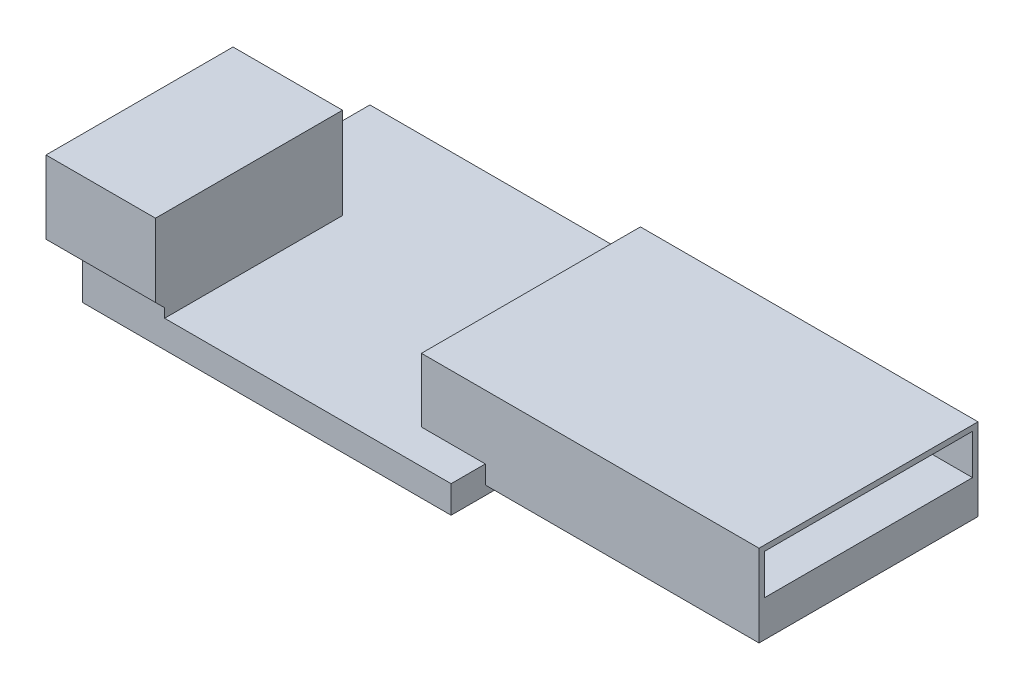
ISO-10303-21;
HEADER;
FILE_DESCRIPTION(('STEP AP214'),'2;1');
FILE_NAME('part.step','',(''),(''),'','','');
FILE_SCHEMA(('AUTOMOTIVE_DESIGN { 1 0 10303 214 1 1 1 1 }'));
ENDSEC;
DATA;
#1=APPLICATION_CONTEXT('core data for automotive mechanical design processes');
#2=APPLICATION_PROTOCOL_DEFINITION('international standard','automotive_design',2000,#1);
#3=PRODUCT_CONTEXT('',#1,'mechanical');
#4=PRODUCT('Part','Part','',(#3));
#5=PRODUCT_RELATED_PRODUCT_CATEGORY('part','',(#4));
#6=PRODUCT_DEFINITION_FORMATION('','',#4);
#7=PRODUCT_DEFINITION_CONTEXT('part definition',#1,'design');
#8=PRODUCT_DEFINITION('design','',#6,#7);
#9=PRODUCT_DEFINITION_SHAPE('','',#8);
#10=(LENGTH_UNIT() NAMED_UNIT(*) SI_UNIT(.MILLI.,.METRE.));
#11=(NAMED_UNIT(*) PLANE_ANGLE_UNIT() SI_UNIT($,.RADIAN.));
#12=(NAMED_UNIT(*) SI_UNIT($,.STERADIAN.) SOLID_ANGLE_UNIT());
#13=UNCERTAINTY_MEASURE_WITH_UNIT(LENGTH_MEASURE(1.E-05),#10,'distance_accuracy_value','');
#14=(GEOMETRIC_REPRESENTATION_CONTEXT(3) GLOBAL_UNCERTAINTY_ASSIGNED_CONTEXT((#13)) GLOBAL_UNIT_ASSIGNED_CONTEXT((#10,
#11,#12)) REPRESENTATION_CONTEXT('',''));
#15=CARTESIAN_POINT('',(0.,0.,0.));
#16=DIRECTION('',(0.,0.,1.));
#17=DIRECTION('',(1.,0.,0.));
#18=AXIS2_PLACEMENT_3D('',#15,#16,#17);
#19=CARTESIAN_POINT('',(0.,1.5,-15.75));
#20=DIRECTION('',(0.,1.,0.));
#21=DIRECTION('',(0.,0.,1.));
#22=AXIS2_PLACEMENT_3D('',#19,#20,#21);
#23=PLANE('',#22);
#24=DIRECTION('',(-1.,0.,0.));
#25=VECTOR('',#24,1.);
#26=CARTESIAN_POINT('',(-15.7,1.5,-9.75));
#27=LINE('',#26,#25);
#28=CARTESIAN_POINT('',(-15.7,1.5,-9.75));
#29=VERTEX_POINT('',#28);
#30=CARTESIAN_POINT('',(-20.2,1.5,-9.75));
#31=VERTEX_POINT('',#30);
#32=EDGE_CURVE('E335',#29,#31,#27,.T.);
#33=ORIENTED_EDGE('',*,*,#32,.F.);
#34=DIRECTION('',(0.,0.,1.));
#35=VECTOR('',#34,1.);
#36=CARTESIAN_POINT('',(-15.7,1.5,-15.75));
#37=LINE('',#36,#35);
#38=CARTESIAN_POINT('',(-15.7,1.5,0.));
#39=VERTEX_POINT('',#38);
#40=EDGE_CURVE('E198',#29,#39,#37,.T.);
#41=ORIENTED_EDGE('',*,*,#40,.T.);
#42=DIRECTION('',(1.,0.,0.));
#43=VECTOR('',#42,1.);
#44=CARTESIAN_POINT('',(0.,1.5,0.));
#45=LINE('',#44,#43);
#46=CARTESIAN_POINT('',(0.,1.5,0.));
#47=VERTEX_POINT('',#46);
#48=EDGE_CURVE('E280',#39,#47,#45,.T.);
#49=ORIENTED_EDGE('',*,*,#48,.T.);
#50=DIRECTION('',(0.,0.,-1.));
#51=VECTOR('',#50,1.);
#52=CARTESIAN_POINT('',(0.,1.5,0.));
#53=LINE('',#52,#51);
#54=CARTESIAN_POINT('',(0.,1.5,-1.875));
#55=VERTEX_POINT('',#54);
#56=EDGE_CURVE('E271',#47,#55,#53,.T.);
#57=ORIENTED_EDGE('',*,*,#56,.T.);
#58=DIRECTION('',(1.,0.,0.));
#59=VECTOR('',#58,1.);
#60=CARTESIAN_POINT('',(0.,1.5,-1.875));
#61=LINE('',#60,#59);
#62=CARTESIAN_POINT('',(-3.5,1.5,-1.875));
#63=VERTEX_POINT('',#62);
#64=EDGE_CURVE('E300',#63,#55,#61,.T.);
#65=ORIENTED_EDGE('',*,*,#64,.F.);
#66=DIRECTION('',(0.,0.,1.));
#67=VECTOR('',#66,1.);
#68=CARTESIAN_POINT('',(-3.5,1.5,-15.75));
#69=LINE('',#68,#67);
#70=CARTESIAN_POINT('',(-3.5,1.5,-13.875));
#71=VERTEX_POINT('',#70);
#72=EDGE_CURVE('E303',#71,#63,#69,.T.);
#73=ORIENTED_EDGE('',*,*,#72,.F.);
#74=DIRECTION('',(-1.,0.,0.));
#75=VECTOR('',#74,1.);
#76=CARTESIAN_POINT('',(0.,1.5,-13.875));
#77=LINE('',#76,#75);
#78=CARTESIAN_POINT('',(0.,1.5,-13.875));
#79=VERTEX_POINT('',#78);
#80=EDGE_CURVE('E306',#79,#71,#77,.T.);
#81=ORIENTED_EDGE('',*,*,#80,.F.);
#82=CARTESIAN_POINT('',(0.,1.5,-15.75));
#83=VERTEX_POINT('',#82);
#84=EDGE_CURVE('E274',#79,#83,#53,.T.);
#85=ORIENTED_EDGE('',*,*,#84,.T.);
#86=DIRECTION('',(-1.,0.,0.));
#87=VECTOR('',#86,1.);
#88=CARTESIAN_POINT('',(0.,1.5,-15.75));
#89=LINE('',#88,#87);
#90=CARTESIAN_POINT('',(-20.2,1.5,-15.75));
#91=VERTEX_POINT('',#90);
#92=EDGE_CURVE('E273',#83,#91,#89,.T.);
#93=ORIENTED_EDGE('',*,*,#92,.T.);
#94=DIRECTION('',(0.,0.,1.));
#95=VECTOR('',#94,1.);
#96=CARTESIAN_POINT('',(-20.2,1.5,0.));
#97=LINE('',#96,#95);
#98=EDGE_CURVE('E277',#91,#31,#97,.T.);
#99=ORIENTED_EDGE('',*,*,#98,.T.);
#100=EDGE_LOOP('',(#33,#41,#49,#57,#65,#73,#81,#85,#93,#99));
#101=FACE_BOUND('',#100,.T.);
#102=ADVANCED_FACE('F32',(#101),#23,.T.);
#103=CARTESIAN_POINT('',(0.,1.5,0.));
#104=DIRECTION('',(-1.,0.,0.));
#105=DIRECTION('',(0.,0.,1.));
#106=AXIS2_PLACEMENT_3D('',#103,#104,#105);
#107=PLANE('',#106);
#108=ORIENTED_EDGE('',*,*,#84,.F.);
#109=DIRECTION('',(0.,-1.,0.));
#110=VECTOR('',#109,1.);
#111=CARTESIAN_POINT('',(0.,1.5,-13.875));
#112=LINE('',#111,#110);
#113=CARTESIAN_POINT('',(0.,0.5,-13.875));
#114=VERTEX_POINT('',#113);
#115=EDGE_CURVE('E268',#79,#114,#112,.T.);
#116=ORIENTED_EDGE('',*,*,#115,.T.);
#117=DIRECTION('',(0.,0.,-1.));
#118=VECTOR('',#117,1.);
#119=CARTESIAN_POINT('',(0.,0.5,0.));
#120=LINE('',#119,#118);
#121=CARTESIAN_POINT('',(0.,0.5,-1.875));
#122=VERTEX_POINT('',#121);
#123=EDGE_CURVE('E309',#122,#114,#120,.T.);
#124=ORIENTED_EDGE('',*,*,#123,.F.);
#125=DIRECTION('',(0.,1.,0.));
#126=VECTOR('',#125,1.);
#127=CARTESIAN_POINT('',(0.,1.5,-1.875));
#128=LINE('',#127,#126);
#129=EDGE_CURVE('E260',#122,#55,#128,.T.);
#130=ORIENTED_EDGE('',*,*,#129,.T.);
#131=ORIENTED_EDGE('',*,*,#56,.F.);
#132=DIRECTION('',(0.,-1.,0.));
#133=VECTOR('',#132,1.);
#134=CARTESIAN_POINT('',(0.,1.5,0.));
#135=LINE('',#134,#133);
#136=CARTESIAN_POINT('',(0.,0.,0.));
#137=VERTEX_POINT('',#136);
#138=EDGE_CURVE('E282',#47,#137,#135,.T.);
#139=ORIENTED_EDGE('',*,*,#138,.T.);
#140=DIRECTION('',(0.,0.,-1.));
#141=VECTOR('',#140,1.);
#142=CARTESIAN_POINT('',(0.,0.,0.));
#143=LINE('',#142,#141);
#144=CARTESIAN_POINT('',(0.,0.,-15.75));
#145=VERTEX_POINT('',#144);
#146=EDGE_CURVE('E270',#137,#145,#143,.T.);
#147=ORIENTED_EDGE('',*,*,#146,.T.);
#148=DIRECTION('',(0.,-1.,0.));
#149=VECTOR('',#148,1.);
#150=CARTESIAN_POINT('',(0.,1.5,-15.75));
#151=LINE('',#150,#149);
#152=EDGE_CURVE('E297',#83,#145,#151,.T.);
#153=ORIENTED_EDGE('',*,*,#152,.F.);
#154=EDGE_LOOP('',(#108,#116,#124,#130,#131,#139,#147,#153));
#155=FACE_BOUND('',#154,.T.);
#156=ADVANCED_FACE('F354',(#155),#107,.F.);
#157=CARTESIAN_POINT('',(0.,1.5,-15.75));
#158=DIRECTION('',(0.,0.,1.));
#159=DIRECTION('',(1.,0.,0.));
#160=AXIS2_PLACEMENT_3D('',#157,#158,#159);
#161=PLANE('',#160);
#162=DIRECTION('',(-1.,0.,0.));
#163=VECTOR('',#162,1.);
#164=CARTESIAN_POINT('',(0.,0.,-15.75));
#165=LINE('',#164,#163);
#166=CARTESIAN_POINT('',(-20.2,0.,-15.75));
#167=VERTEX_POINT('',#166);
#168=EDGE_CURVE('E285',#145,#167,#165,.T.);
#169=ORIENTED_EDGE('',*,*,#168,.T.);
#170=DIRECTION('',(0.,-1.,0.));
#171=VECTOR('',#170,1.);
#172=CARTESIAN_POINT('',(-20.2,1.5,-15.75));
#173=LINE('',#172,#171);
#174=EDGE_CURVE('E294',#91,#167,#173,.T.);
#175=ORIENTED_EDGE('',*,*,#174,.F.);
#176=ORIENTED_EDGE('',*,*,#92,.F.);
#177=ORIENTED_EDGE('',*,*,#152,.T.);
#178=EDGE_LOOP('',(#169,#175,#176,#177));
#179=FACE_BOUND('',#178,.T.);
#180=ADVANCED_FACE('F375',(#179),#161,.F.);
#181=CARTESIAN_POINT('',(-20.2,1.5,0.));
#182=DIRECTION('',(1.,0.,0.));
#183=DIRECTION('',(0.,0.,-1.));
#184=AXIS2_PLACEMENT_3D('',#181,#182,#183);
#185=PLANE('',#184);
#186=DIRECTION('',(0.,0.,1.));
#187=VECTOR('',#186,1.);
#188=CARTESIAN_POINT('',(-20.2,0.,0.));
#189=LINE('',#188,#187);
#190=CARTESIAN_POINT('',(-20.2,0.,0.));
#191=VERTEX_POINT('',#190);
#192=EDGE_CURVE('E287',#167,#191,#189,.T.);
#193=ORIENTED_EDGE('',*,*,#192,.T.);
#194=DIRECTION('',(0.,-1.,0.));
#195=VECTOR('',#194,1.);
#196=CARTESIAN_POINT('',(-20.2,1.5,0.));
#197=LINE('',#196,#195);
#198=CARTESIAN_POINT('',(-20.2,2.00000000000001,0.));
#199=VERTEX_POINT('',#198);
#200=EDGE_CURVE('E46',#199,#191,#197,.T.);
#201=ORIENTED_EDGE('',*,*,#200,.F.);
#202=DIRECTION('',(0.,0.707106781186551,0.707106781186544));
#203=VECTOR('',#202,1.);
#204=CARTESIAN_POINT('',(-20.2,1.75,-0.250000000000003));
#205=LINE('',#204,#203);
#206=CARTESIAN_POINT('',(-20.2,1.5,-0.500000000000004));
#207=VERTEX_POINT('',#206);
#208=EDGE_CURVE('E11',#199,#207,#205,.F.);
#209=ORIENTED_EDGE('',*,*,#208,.T.);
#210=EDGE_CURVE('E276',#31,#207,#97,.T.);
#211=ORIENTED_EDGE('',*,*,#210,.F.);
#212=ORIENTED_EDGE('',*,*,#98,.F.);
#213=ORIENTED_EDGE('',*,*,#174,.T.);
#214=EDGE_LOOP('',(#193,#201,#209,#211,#212,#213));
#215=FACE_BOUND('',#214,.T.);
#216=ADVANCED_FACE('F331',(#215),#185,.F.);
#217=CARTESIAN_POINT('',(0.,1.5,0.));
#218=DIRECTION('',(0.,0.,-1.));
#219=DIRECTION('',(-1.,0.,0.));
#220=AXIS2_PLACEMENT_3D('',#217,#218,#219);
#221=PLANE('',#220);
#222=DIRECTION('',(1.,0.,0.));
#223=VECTOR('',#222,1.);
#224=CARTESIAN_POINT('',(0.,0.,0.));
#225=LINE('',#224,#223);
#226=EDGE_CURVE('E289',#191,#137,#225,.T.);
#227=ORIENTED_EDGE('',*,*,#226,.T.);
#228=ORIENTED_EDGE('',*,*,#138,.F.);
#229=ORIENTED_EDGE('',*,*,#48,.F.);
#230=DIRECTION('',(0.,-1.,0.));
#231=VECTOR('',#230,1.);
#232=CARTESIAN_POINT('',(-15.7,6.5,0.));
#233=LINE('',#232,#231);
#234=CARTESIAN_POINT('',(-15.7,2.00000000000001,0.));
#235=VERTEX_POINT('',#234);
#236=EDGE_CURVE('E318',#235,#39,#233,.T.);
#237=ORIENTED_EDGE('',*,*,#236,.F.);
#238=DIRECTION('',(1.,0.,0.));
#239=VECTOR('',#238,1.);
#240=CARTESIAN_POINT('',(0.,2.00000000000001,0.));
#241=LINE('',#240,#239);
#242=EDGE_CURVE('E40',#235,#199,#241,.F.);
#243=ORIENTED_EDGE('',*,*,#242,.T.);
#244=ORIENTED_EDGE('',*,*,#200,.T.);
#245=EDGE_LOOP('',(#227,#228,#229,#237,#243,#244));
#246=FACE_BOUND('',#245,.T.);
#247=ADVANCED_FACE('F325',(#246),#221,.F.);
#248=CARTESIAN_POINT('',(0.,0.,-15.75));
#249=DIRECTION('',(0.,1.,0.));
#250=DIRECTION('',(0.,0.,1.));
#251=AXIS2_PLACEMENT_3D('',#248,#249,#250);
#252=PLANE('',#251);
#253=ORIENTED_EDGE('',*,*,#146,.F.);
#254=ORIENTED_EDGE('',*,*,#226,.F.);
#255=ORIENTED_EDGE('',*,*,#192,.F.);
#256=ORIENTED_EDGE('',*,*,#168,.F.);
#257=EDGE_LOOP('',(#253,#254,#255,#256));
#258=FACE_BOUND('',#257,.T.);
#259=ADVANCED_FACE('F379',(#258),#252,.F.);
#260=CARTESIAN_POINT('',(-3.5,0.5,-1.875));
#261=DIRECTION('',(0.,1.,0.));
#262=DIRECTION('',(0.,0.,1.));
#263=AXIS2_PLACEMENT_3D('',#260,#261,#262);
#264=PLANE('',#263);
#265=DIRECTION('',(1.,0.,0.));
#266=VECTOR('',#265,1.);
#267=CARTESIAN_POINT('',(-3.5,0.5,-1.875));
#268=LINE('',#267,#266);
#269=CARTESIAN_POINT('',(15.,0.5,-1.875));
#270=VERTEX_POINT('',#269);
#271=EDGE_CURVE('E249',#122,#270,#268,.T.);
#272=ORIENTED_EDGE('',*,*,#271,.F.);
#273=ORIENTED_EDGE('',*,*,#123,.T.);
#274=DIRECTION('',(-1.,0.,0.));
#275=VECTOR('',#274,1.);
#276=CARTESIAN_POINT('',(-3.5,0.5,-13.875));
#277=LINE('',#276,#275);
#278=CARTESIAN_POINT('',(15.,0.5,-13.875));
#279=VERTEX_POINT('',#278);
#280=EDGE_CURVE('E254',#279,#114,#277,.T.);
#281=ORIENTED_EDGE('',*,*,#280,.F.);
#282=DIRECTION('',(0.,0.,-1.));
#283=VECTOR('',#282,1.);
#284=CARTESIAN_POINT('',(15.,0.5,-13.875));
#285=LINE('',#284,#283);
#286=EDGE_CURVE('E251',#270,#279,#285,.T.);
#287=ORIENTED_EDGE('',*,*,#286,.F.);
#288=EDGE_LOOP('',(#272,#273,#281,#287));
#289=FACE_BOUND('',#288,.T.);
#290=ADVANCED_FACE('F381',(#289),#264,.F.);
#291=CARTESIAN_POINT('',(-3.5,0.5,-13.875));
#292=DIRECTION('',(0.,0.,-1.));
#293=DIRECTION('',(-1.,0.,0.));
#294=AXIS2_PLACEMENT_3D('',#291,#292,#293);
#295=PLANE('',#294);
#296=ORIENTED_EDGE('',*,*,#115,.F.);
#297=ORIENTED_EDGE('',*,*,#80,.T.);
#298=DIRECTION('',(0.,1.,0.));
#299=VECTOR('',#298,1.);
#300=CARTESIAN_POINT('',(-3.5,0.5,-13.875));
#301=LINE('',#300,#299);
#302=CARTESIAN_POINT('',(-3.5,5.,-13.875));
#303=VERTEX_POINT('',#302);
#304=EDGE_CURVE('E258',#71,#303,#301,.T.);
#305=ORIENTED_EDGE('',*,*,#304,.T.);
#306=DIRECTION('',(-1.,0.,0.));
#307=VECTOR('',#306,1.);
#308=CARTESIAN_POINT('',(-3.5,5.,-13.875));
#309=LINE('',#308,#307);
#310=CARTESIAN_POINT('',(15.,5.,-13.875));
#311=VERTEX_POINT('',#310);
#312=EDGE_CURVE('E246',#311,#303,#309,.T.);
#313=ORIENTED_EDGE('',*,*,#312,.F.);
#314=DIRECTION('',(0.,1.,0.));
#315=VECTOR('',#314,1.);
#316=CARTESIAN_POINT('',(15.,0.5,-13.875));
#317=LINE('',#316,#315);
#318=EDGE_CURVE('E261',#279,#311,#317,.T.);
#319=ORIENTED_EDGE('',*,*,#318,.F.);
#320=ORIENTED_EDGE('',*,*,#280,.T.);
#321=EDGE_LOOP('',(#296,#297,#305,#313,#319,#320));
#322=FACE_BOUND('',#321,.T.);
#323=ADVANCED_FACE('F371',(#322),#295,.T.);
#324=CARTESIAN_POINT('',(-3.5,0.5,-1.875));
#325=DIRECTION('',(0.,0.,1.));
#326=DIRECTION('',(1.,0.,0.));
#327=AXIS2_PLACEMENT_3D('',#324,#325,#326);
#328=PLANE('',#327);
#329=ORIENTED_EDGE('',*,*,#129,.F.);
#330=ORIENTED_EDGE('',*,*,#271,.T.);
#331=DIRECTION('',(0.,1.,0.));
#332=VECTOR('',#331,1.);
#333=CARTESIAN_POINT('',(15.,0.5,-1.875));
#334=LINE('',#333,#332);
#335=CARTESIAN_POINT('',(15.,5.,-1.875));
#336=VERTEX_POINT('',#335);
#337=EDGE_CURVE('E263',#270,#336,#334,.T.);
#338=ORIENTED_EDGE('',*,*,#337,.T.);
#339=DIRECTION('',(1.,0.,0.));
#340=VECTOR('',#339,1.);
#341=CARTESIAN_POINT('',(-3.5,5.,-1.875));
#342=LINE('',#341,#340);
#343=CARTESIAN_POINT('',(-3.5,5.,-1.875));
#344=VERTEX_POINT('',#343);
#345=EDGE_CURVE('E240',#344,#336,#342,.T.);
#346=ORIENTED_EDGE('',*,*,#345,.F.);
#347=DIRECTION('',(0.,1.,0.));
#348=VECTOR('',#347,1.);
#349=CARTESIAN_POINT('',(-3.5,0.5,-1.875));
#350=LINE('',#349,#348);
#351=EDGE_CURVE('E257',#63,#344,#350,.T.);
#352=ORIENTED_EDGE('',*,*,#351,.F.);
#353=ORIENTED_EDGE('',*,*,#64,.T.);
#354=EDGE_LOOP('',(#329,#330,#338,#346,#352,#353));
#355=FACE_BOUND('',#354,.T.);
#356=ADVANCED_FACE('F363',(#355),#328,.T.);
#357=CARTESIAN_POINT('',(-3.5,0.5,-13.875));
#358=DIRECTION('',(-1.,0.,0.));
#359=DIRECTION('',(0.,0.,1.));
#360=AXIS2_PLACEMENT_3D('',#357,#358,#359);
#361=PLANE('',#360);
#362=ORIENTED_EDGE('',*,*,#304,.F.);
#363=ORIENTED_EDGE('',*,*,#72,.T.);
#364=ORIENTED_EDGE('',*,*,#351,.T.);
#365=DIRECTION('',(0.,0.,1.));
#366=VECTOR('',#365,1.);
#367=CARTESIAN_POINT('',(-3.5,5.,-13.875));
#368=LINE('',#367,#366);
#369=EDGE_CURVE('E231',#303,#344,#368,.T.);
#370=ORIENTED_EDGE('',*,*,#369,.F.);
#371=EDGE_LOOP('',(#362,#363,#364,#370));
#372=FACE_BOUND('',#371,.T.);
#373=ADVANCED_FACE('F360',(#372),#361,.T.);
#374=CARTESIAN_POINT('',(15.,0.5,-13.875));
#375=DIRECTION('',(1.,0.,0.));
#376=DIRECTION('',(0.,0.,-1.));
#377=AXIS2_PLACEMENT_3D('',#374,#375,#376);
#378=PLANE('',#377);
#379=DIRECTION('',(0.,-1.,0.));
#380=VECTOR('',#379,1.);
#381=CARTESIAN_POINT('',(15.,4.7,-2.175));
#382=LINE('',#381,#380);
#383=CARTESIAN_POINT('',(15.,4.7,-2.175));
#384=VERTEX_POINT('',#383);
#385=CARTESIAN_POINT('',(15.,2.5,-2.175));
#386=VERTEX_POINT('',#385);
#387=EDGE_CURVE('E200',#384,#386,#382,.T.);
#388=ORIENTED_EDGE('',*,*,#387,.F.);
#389=DIRECTION('',(0.,0.,1.));
#390=VECTOR('',#389,1.);
#391=CARTESIAN_POINT('',(15.,4.7,-2.175));
#392=LINE('',#391,#390);
#393=CARTESIAN_POINT('',(15.,4.7,-13.575));
#394=VERTEX_POINT('',#393);
#395=EDGE_CURVE('E212',#394,#384,#392,.T.);
#396=ORIENTED_EDGE('',*,*,#395,.F.);
#397=DIRECTION('',(0.,1.,0.));
#398=VECTOR('',#397,1.);
#399=CARTESIAN_POINT('',(15.,4.7,-13.575));
#400=LINE('',#399,#398);
#401=CARTESIAN_POINT('',(15.,2.5,-13.575));
#402=VERTEX_POINT('',#401);
#403=EDGE_CURVE('E224',#402,#394,#400,.T.);
#404=ORIENTED_EDGE('',*,*,#403,.F.);
#405=DIRECTION('',(0.,0.,-1.));
#406=VECTOR('',#405,1.);
#407=CARTESIAN_POINT('',(15.,2.5,-2.175));
#408=LINE('',#407,#406);
#409=EDGE_CURVE('E202',#386,#402,#408,.T.);
#410=ORIENTED_EDGE('',*,*,#409,.F.);
#411=EDGE_LOOP('',(#388,#396,#404,#410));
#412=FACE_BOUND('',#411,.T.);
#413=ORIENTED_EDGE('',*,*,#318,.T.);
#414=DIRECTION('',(0.,0.,-1.));
#415=VECTOR('',#414,1.);
#416=CARTESIAN_POINT('',(15.,5.,-13.875));
#417=LINE('',#416,#415);
#418=EDGE_CURVE('E243',#336,#311,#417,.T.);
#419=ORIENTED_EDGE('',*,*,#418,.F.);
#420=ORIENTED_EDGE('',*,*,#337,.F.);
#421=ORIENTED_EDGE('',*,*,#286,.T.);
#422=EDGE_LOOP('',(#413,#419,#420,#421));
#423=FACE_BOUND('',#422,.T.);
#424=ADVANCED_FACE('F398',(#412,#423),#378,.T.);
#425=CARTESIAN_POINT('',(-3.5,5.,-1.875));
#426=DIRECTION('',(0.,1.,0.));
#427=DIRECTION('',(0.,0.,1.));
#428=AXIS2_PLACEMENT_3D('',#425,#426,#427);
#429=PLANE('',#428);
#430=ORIENTED_EDGE('',*,*,#369,.T.);
#431=ORIENTED_EDGE('',*,*,#345,.T.);
#432=ORIENTED_EDGE('',*,*,#418,.T.);
#433=ORIENTED_EDGE('',*,*,#312,.T.);
#434=EDGE_LOOP('',(#430,#431,#432,#433));
#435=FACE_BOUND('',#434,.T.);
#436=ADVANCED_FACE('F367',(#435),#429,.T.);
#437=CARTESIAN_POINT('',(1.5,4.7,-2.175));
#438=DIRECTION('',(0.,0.,1.));
#439=DIRECTION('',(0.,-1.,0.));
#440=AXIS2_PLACEMENT_3D('',#437,#438,#439);
#441=PLANE('',#440);
#442=ORIENTED_EDGE('',*,*,#387,.T.);
#443=DIRECTION('',(1.,0.,0.));
#444=VECTOR('',#443,1.);
#445=CARTESIAN_POINT('',(1.5,2.5,-2.175));
#446=LINE('',#445,#444);
#447=CARTESIAN_POINT('',(1.5,2.5,-2.175));
#448=VERTEX_POINT('',#447);
#449=EDGE_CURVE('E220',#448,#386,#446,.T.);
#450=ORIENTED_EDGE('',*,*,#449,.F.);
#451=DIRECTION('',(0.,-1.,0.));
#452=VECTOR('',#451,1.);
#453=CARTESIAN_POINT('',(1.5,4.7,-2.175));
#454=LINE('',#453,#452);
#455=CARTESIAN_POINT('',(1.5,4.7,-2.175));
#456=VERTEX_POINT('',#455);
#457=EDGE_CURVE('E208',#456,#448,#454,.T.);
#458=ORIENTED_EDGE('',*,*,#457,.F.);
#459=DIRECTION('',(1.,0.,0.));
#460=VECTOR('',#459,1.);
#461=CARTESIAN_POINT('',(1.5,4.7,-2.175));
#462=LINE('',#461,#460);
#463=EDGE_CURVE('E229',#456,#384,#462,.T.);
#464=ORIENTED_EDGE('',*,*,#463,.T.);
#465=EDGE_LOOP('',(#442,#450,#458,#464));
#466=FACE_BOUND('',#465,.T.);
#467=ADVANCED_FACE('F408',(#466),#441,.F.);
#468=CARTESIAN_POINT('',(1.5,4.7,-2.175));
#469=DIRECTION('',(0.,1.,0.));
#470=DIRECTION('',(0.,0.,1.));
#471=AXIS2_PLACEMENT_3D('',#468,#469,#470);
#472=PLANE('',#471);
#473=ORIENTED_EDGE('',*,*,#395,.T.);
#474=ORIENTED_EDGE('',*,*,#463,.F.);
#475=DIRECTION('',(0.,0.,1.));
#476=VECTOR('',#475,1.);
#477=CARTESIAN_POINT('',(1.5,4.7,-2.175));
#478=LINE('',#477,#476);
#479=CARTESIAN_POINT('',(1.5,4.7,-13.575));
#480=VERTEX_POINT('',#479);
#481=EDGE_CURVE('E218',#480,#456,#478,.T.);
#482=ORIENTED_EDGE('',*,*,#481,.F.);
#483=DIRECTION('',(1.,0.,0.));
#484=VECTOR('',#483,1.);
#485=CARTESIAN_POINT('',(1.5,4.7,-13.575));
#486=LINE('',#485,#484);
#487=EDGE_CURVE('E232',#480,#394,#486,.T.);
#488=ORIENTED_EDGE('',*,*,#487,.T.);
#489=EDGE_LOOP('',(#473,#474,#482,#488));
#490=FACE_BOUND('',#489,.T.);
#491=ADVANCED_FACE('F411',(#490),#472,.F.);
#492=CARTESIAN_POINT('',(1.5,4.7,-13.575));
#493=DIRECTION('',(0.,0.,-1.));
#494=DIRECTION('',(-1.,0.,0.));
#495=AXIS2_PLACEMENT_3D('',#492,#493,#494);
#496=PLANE('',#495);
#497=ORIENTED_EDGE('',*,*,#403,.T.);
#498=ORIENTED_EDGE('',*,*,#487,.F.);
#499=DIRECTION('',(0.,1.,0.));
#500=VECTOR('',#499,1.);
#501=CARTESIAN_POINT('',(1.5,4.7,-13.575));
#502=LINE('',#501,#500);
#503=CARTESIAN_POINT('',(1.5,2.5,-13.575));
#504=VERTEX_POINT('',#503);
#505=EDGE_CURVE('E215',#504,#480,#502,.T.);
#506=ORIENTED_EDGE('',*,*,#505,.F.);
#507=DIRECTION('',(1.,0.,0.));
#508=VECTOR('',#507,1.);
#509=CARTESIAN_POINT('',(1.5,2.5,-13.575));
#510=LINE('',#509,#508);
#511=EDGE_CURVE('E234',#504,#402,#510,.T.);
#512=ORIENTED_EDGE('',*,*,#511,.T.);
#513=EDGE_LOOP('',(#497,#498,#506,#512));
#514=FACE_BOUND('',#513,.T.);
#515=ADVANCED_FACE('F417',(#514),#496,.F.);
#516=CARTESIAN_POINT('',(1.5,2.5,-2.175));
#517=DIRECTION('',(0.,-1.,0.));
#518=DIRECTION('',(0.,0.,-1.));
#519=AXIS2_PLACEMENT_3D('',#516,#517,#518);
#520=PLANE('',#519);
#521=ORIENTED_EDGE('',*,*,#409,.T.);
#522=ORIENTED_EDGE('',*,*,#511,.F.);
#523=DIRECTION('',(0.,0.,-1.));
#524=VECTOR('',#523,1.);
#525=CARTESIAN_POINT('',(1.5,2.5,-2.175));
#526=LINE('',#525,#524);
#527=EDGE_CURVE('E211',#448,#504,#526,.T.);
#528=ORIENTED_EDGE('',*,*,#527,.F.);
#529=ORIENTED_EDGE('',*,*,#449,.T.);
#530=EDGE_LOOP('',(#521,#522,#528,#529));
#531=FACE_BOUND('',#530,.T.);
#532=ADVANCED_FACE('F413',(#531),#520,.F.);
#533=CARTESIAN_POINT('',(1.5,2.5,-2.175));
#534=DIRECTION('',(1.,0.,0.));
#535=DIRECTION('',(0.,0.,-1.));
#536=AXIS2_PLACEMENT_3D('',#533,#534,#535);
#537=PLANE('',#536);
#538=ORIENTED_EDGE('',*,*,#457,.T.);
#539=ORIENTED_EDGE('',*,*,#527,.T.);
#540=ORIENTED_EDGE('',*,*,#505,.T.);
#541=ORIENTED_EDGE('',*,*,#481,.T.);
#542=EDGE_LOOP('',(#538,#539,#540,#541));
#543=FACE_BOUND('',#542,.T.);
#544=ADVANCED_FACE('F416',(#543),#537,.T.);
#545=CARTESIAN_POINT('',(-15.7,1.5,-9.75));
#546=DIRECTION('',(0.,1.,0.));
#547=DIRECTION('',(0.,0.,1.));
#548=AXIS2_PLACEMENT_3D('',#545,#546,#547);
#549=PLANE('',#548);
#550=ORIENTED_EDGE('',*,*,#210,.T.);
#551=DIRECTION('',(-1.,0.,0.));
#552=VECTOR('',#551,1.);
#553=CARTESIAN_POINT('',(-15.7,1.5,-0.500000000000004));
#554=LINE('',#553,#552);
#555=CARTESIAN_POINT('',(-21.7,1.5,-0.500000000000003));
#556=VERTEX_POINT('',#555);
#557=EDGE_CURVE('E54',#207,#556,#554,.T.);
#558=ORIENTED_EDGE('',*,*,#557,.T.);
#559=DIRECTION('',(0.,0.,1.));
#560=VECTOR('',#559,1.);
#561=CARTESIAN_POINT('',(-21.7,1.5,0.500000000000003));
#562=LINE('',#561,#560);
#563=CARTESIAN_POINT('',(-21.7,1.5,-9.75));
#564=VERTEX_POINT('',#563);
#565=EDGE_CURVE('E193',#564,#556,#562,.T.);
#566=ORIENTED_EDGE('',*,*,#565,.F.);
#567=EDGE_CURVE('E334',#31,#564,#27,.T.);
#568=ORIENTED_EDGE('',*,*,#567,.F.);
#569=EDGE_LOOP('',(#550,#558,#566,#568));
#570=FACE_BOUND('',#569,.T.);
#571=ADVANCED_FACE('F333',(#570),#549,.F.);
#572=CARTESIAN_POINT('',(-15.7,6.5,0.500000000000003));
#573=DIRECTION('',(-1.,0.,0.));
#574=DIRECTION('',(0.,0.,1.));
#575=AXIS2_PLACEMENT_3D('',#572,#573,#574);
#576=PLANE('',#575);
#577=DIRECTION('',(0.,0.707106781186551,0.707106781186544));
#578=VECTOR('',#577,1.);
#579=CARTESIAN_POINT('',(-15.7,2.50000000000002,0.500000000000003));
#580=LINE('',#579,#578);
#581=CARTESIAN_POINT('',(-15.7,2.50000000000002,0.500000000000003));
#582=VERTEX_POINT('',#581);
#583=EDGE_CURVE('E316',#582,#235,#580,.F.);
#584=ORIENTED_EDGE('',*,*,#583,.T.);
#585=ORIENTED_EDGE('',*,*,#236,.T.);
#586=ORIENTED_EDGE('',*,*,#40,.F.);
#587=DIRECTION('',(0.,-1.,0.));
#588=VECTOR('',#587,1.);
#589=CARTESIAN_POINT('',(-15.7,6.5,-9.75));
#590=LINE('',#589,#588);
#591=CARTESIAN_POINT('',(-15.7,6.5,-9.75));
#592=VERTEX_POINT('',#591);
#593=EDGE_CURVE('E177',#592,#29,#590,.T.);
#594=ORIENTED_EDGE('',*,*,#593,.F.);
#595=DIRECTION('',(0.,0.,-1.));
#596=VECTOR('',#595,1.);
#597=CARTESIAN_POINT('',(-15.7,6.5,0.500000000000003));
#598=LINE('',#597,#596);
#599=CARTESIAN_POINT('',(-15.7,6.5,0.500000000000003));
#600=VERTEX_POINT('',#599);
#601=EDGE_CURVE('E184',#600,#592,#598,.T.);
#602=ORIENTED_EDGE('',*,*,#601,.F.);
#603=DIRECTION('',(0.,-1.,0.));
#604=VECTOR('',#603,1.);
#605=CARTESIAN_POINT('',(-15.7,6.5,0.500000000000003));
#606=LINE('',#605,#604);
#607=EDGE_CURVE('E342',#600,#582,#606,.T.);
#608=ORIENTED_EDGE('',*,*,#607,.T.);
#609=EDGE_LOOP('',(#584,#585,#586,#594,#602,#608));
#610=FACE_BOUND('',#609,.T.);
#611=ADVANCED_FACE('F196',(#610),#576,.F.);
#612=CARTESIAN_POINT('',(-15.7,6.5,-9.75));
#613=DIRECTION('',(0.,0.,1.));
#614=DIRECTION('',(1.,0.,0.));
#615=AXIS2_PLACEMENT_3D('',#612,#613,#614);
#616=PLANE('',#615);
#617=ORIENTED_EDGE('',*,*,#32,.T.);
#618=ORIENTED_EDGE('',*,*,#567,.T.);
#619=DIRECTION('',(0.,-1.,0.));
#620=VECTOR('',#619,1.);
#621=CARTESIAN_POINT('',(-21.7,6.5,-9.75));
#622=LINE('',#621,#620);
#623=CARTESIAN_POINT('',(-21.7,6.5,-9.75));
#624=VERTEX_POINT('',#623);
#625=EDGE_CURVE('E180',#624,#564,#622,.T.);
#626=ORIENTED_EDGE('',*,*,#625,.F.);
#627=DIRECTION('',(-1.,0.,0.));
#628=VECTOR('',#627,1.);
#629=CARTESIAN_POINT('',(-15.7,6.5,-9.75));
#630=LINE('',#629,#628);
#631=EDGE_CURVE('E172',#592,#624,#630,.T.);
#632=ORIENTED_EDGE('',*,*,#631,.F.);
#633=ORIENTED_EDGE('',*,*,#593,.T.);
#634=EDGE_LOOP('',(#617,#618,#626,#632,#633));
#635=FACE_BOUND('',#634,.T.);
#636=ADVANCED_FACE('F175',(#635),#616,.F.);
#637=CARTESIAN_POINT('',(-21.7,6.5,0.500000000000003));
#638=DIRECTION('',(1.,0.,0.));
#639=DIRECTION('',(0.,0.,-1.));
#640=AXIS2_PLACEMENT_3D('',#637,#638,#639);
#641=PLANE('',#640);
#642=ORIENTED_EDGE('',*,*,#565,.T.);
#643=DIRECTION('',(0.,-0.707106781186551,-0.707106781186544));
#644=VECTOR('',#643,1.);
#645=CARTESIAN_POINT('',(-21.7,2.50000000000002,0.500000000000003));
#646=LINE('',#645,#644);
#647=CARTESIAN_POINT('',(-21.7,2.50000000000002,0.500000000000003));
#648=VERTEX_POINT('',#647);
#649=EDGE_CURVE('E321',#556,#648,#646,.F.);
#650=ORIENTED_EDGE('',*,*,#649,.T.);
#651=DIRECTION('',(0.,-1.,0.));
#652=VECTOR('',#651,1.);
#653=CARTESIAN_POINT('',(-21.7,6.5,0.500000000000003));
#654=LINE('',#653,#652);
#655=CARTESIAN_POINT('',(-21.7,6.5,0.500000000000003));
#656=VERTEX_POINT('',#655);
#657=EDGE_CURVE('E204',#656,#648,#654,.T.);
#658=ORIENTED_EDGE('',*,*,#657,.F.);
#659=DIRECTION('',(0.,0.,1.));
#660=VECTOR('',#659,1.);
#661=CARTESIAN_POINT('',(-21.7,6.5,0.500000000000003));
#662=LINE('',#661,#660);
#663=EDGE_CURVE('E183',#624,#656,#662,.T.);
#664=ORIENTED_EDGE('',*,*,#663,.F.);
#665=ORIENTED_EDGE('',*,*,#625,.T.);
#666=EDGE_LOOP('',(#642,#650,#658,#664,#665));
#667=FACE_BOUND('',#666,.T.);
#668=ADVANCED_FACE('F432',(#667),#641,.F.);
#669=CARTESIAN_POINT('',(-15.7,6.5,0.500000000000003));
#670=DIRECTION('',(0.,0.,-1.));
#671=DIRECTION('',(-1.,0.,0.));
#672=AXIS2_PLACEMENT_3D('',#669,#670,#671);
#673=PLANE('',#672);
#674=ORIENTED_EDGE('',*,*,#657,.T.);
#675=DIRECTION('',(1.,0.,0.));
#676=VECTOR('',#675,1.);
#677=CARTESIAN_POINT('',(-15.7,2.50000000000002,0.500000000000003));
#678=LINE('',#677,#676);
#679=EDGE_CURVE('E313',#648,#582,#678,.T.);
#680=ORIENTED_EDGE('',*,*,#679,.T.);
#681=ORIENTED_EDGE('',*,*,#607,.F.);
#682=DIRECTION('',(1.,0.,0.));
#683=VECTOR('',#682,1.);
#684=CARTESIAN_POINT('',(-15.7,6.5,0.500000000000003));
#685=LINE('',#684,#683);
#686=EDGE_CURVE('E189',#656,#600,#685,.T.);
#687=ORIENTED_EDGE('',*,*,#686,.F.);
#688=EDGE_LOOP('',(#674,#680,#681,#687));
#689=FACE_BOUND('',#688,.T.);
#690=ADVANCED_FACE('F347',(#689),#673,.F.);
#691=CARTESIAN_POINT('',(-15.7,6.5,-9.75));
#692=DIRECTION('',(0.,1.,0.));
#693=DIRECTION('',(0.,0.,1.));
#694=AXIS2_PLACEMENT_3D('',#691,#692,#693);
#695=PLANE('',#694);
#696=ORIENTED_EDGE('',*,*,#601,.T.);
#697=ORIENTED_EDGE('',*,*,#631,.T.);
#698=ORIENTED_EDGE('',*,*,#663,.T.);
#699=ORIENTED_EDGE('',*,*,#686,.T.);
#700=EDGE_LOOP('',(#696,#697,#698,#699));
#701=FACE_BOUND('',#700,.T.);
#702=ADVANCED_FACE('F187',(#701),#695,.T.);
#703=CARTESIAN_POINT('',(-15.7,2.50000000000002,0.500000000000003));
#704=DIRECTION('',(0.,0.707106781186544,-0.707106781186552));
#705=DIRECTION('',(0.,0.707106781186551,0.707106781186544));
#706=AXIS2_PLACEMENT_3D('',#703,#704,#705);
#707=PLANE('',#706);
#708=ORIENTED_EDGE('',*,*,#649,.F.);
#709=ORIENTED_EDGE('',*,*,#557,.F.);
#710=ORIENTED_EDGE('',*,*,#208,.F.);
#711=ORIENTED_EDGE('',*,*,#242,.F.);
#712=ORIENTED_EDGE('',*,*,#583,.F.);
#713=ORIENTED_EDGE('',*,*,#679,.F.);
#714=EDGE_LOOP('',(#708,#709,#710,#711,#712,#713));
#715=FACE_BOUND('',#714,.T.);
#716=ADVANCED_FACE('F34',(#715),#707,.F.);
#717=CLOSED_SHELL('',(#102,#156,#180,#216,#247,#259,#290,#323,#356,#373,#424,#436,#467,#491,
#515,#532,#544,#571,#611,#636,#668,#690,#702,#716));
#718=MANIFOLD_SOLID_BREP('B2',#717);
#719=ADVANCED_BREP_SHAPE_REPRESENTATION('',(#18,#718),#14);
#720=SHAPE_DEFINITION_REPRESENTATION(#9,#719);
ENDSEC;
END-ISO-10303-21;
